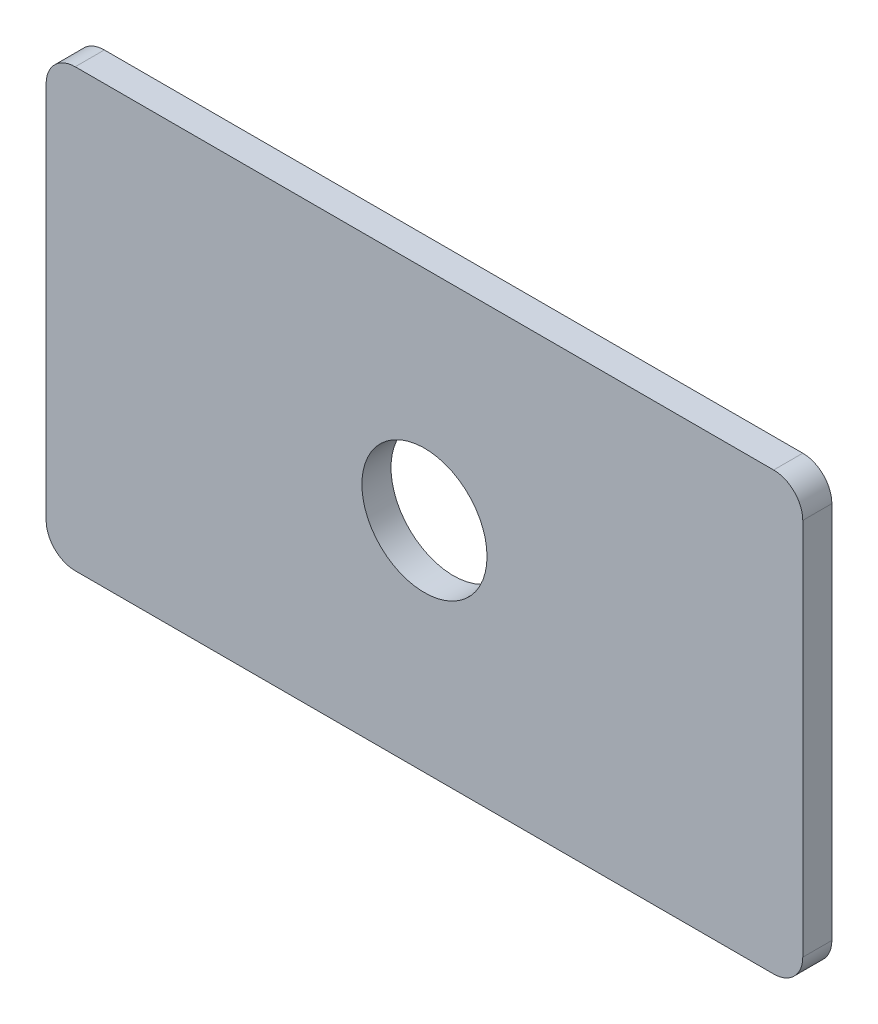
ISO-10303-21;
HEADER;
FILE_DESCRIPTION(('STEP AP214'),'2;1');
FILE_NAME('part.step','',(''),(''),'','','');
FILE_SCHEMA(('AUTOMOTIVE_DESIGN { 1 0 10303 214 1 1 1 1 }'));
ENDSEC;
DATA;
#1=APPLICATION_CONTEXT('core data for automotive mechanical design processes');
#2=APPLICATION_PROTOCOL_DEFINITION('international standard','automotive_design',2000,#1);
#3=PRODUCT_CONTEXT('',#1,'mechanical');
#4=PRODUCT('Part','Part','',(#3));
#5=PRODUCT_RELATED_PRODUCT_CATEGORY('part','',(#4));
#6=PRODUCT_DEFINITION_FORMATION('','',#4);
#7=PRODUCT_DEFINITION_CONTEXT('part definition',#1,'design');
#8=PRODUCT_DEFINITION('design','',#6,#7);
#9=PRODUCT_DEFINITION_SHAPE('','',#8);
#10=(LENGTH_UNIT() NAMED_UNIT(*) SI_UNIT(.MILLI.,.METRE.));
#11=(NAMED_UNIT(*) PLANE_ANGLE_UNIT() SI_UNIT($,.RADIAN.));
#12=(NAMED_UNIT(*) SI_UNIT($,.STERADIAN.) SOLID_ANGLE_UNIT());
#13=UNCERTAINTY_MEASURE_WITH_UNIT(LENGTH_MEASURE(1.E-05),#10,'distance_accuracy_value','');
#14=(GEOMETRIC_REPRESENTATION_CONTEXT(3) GLOBAL_UNCERTAINTY_ASSIGNED_CONTEXT((#13)) GLOBAL_UNIT_ASSIGNED_CONTEXT((#10,
#11,#12)) REPRESENTATION_CONTEXT('',''));
#15=CARTESIAN_POINT('',(0.,0.,0.));
#16=DIRECTION('',(0.,0.,1.));
#17=DIRECTION('',(1.,0.,0.));
#18=AXIS2_PLACEMENT_3D('',#15,#16,#17);
#19=CARTESIAN_POINT('',(0.,0.,5.));
#20=DIRECTION('',(0.,0.,-1.));
#21=DIRECTION('',(-1.,0.,0.));
#22=AXIS2_PLACEMENT_3D('',#19,#20,#21);
#23=PLANE('',#22);
#24=DIRECTION('',(0.,-1.,0.));
#25=VECTOR('',#24,1.);
#26=CARTESIAN_POINT('',(-130.,-75.,5.));
#27=LINE('',#26,#25);
#28=CARTESIAN_POINT('',(-130.,65.,5.));
#29=VERTEX_POINT('',#28);
#30=CARTESIAN_POINT('',(-130.,-65.,5.));
#31=VERTEX_POINT('',#30);
#32=EDGE_CURVE('E180',#29,#31,#27,.T.);
#33=ORIENTED_EDGE('',*,*,#32,.T.);
#34=CARTESIAN_POINT('',(-120.,-65.,5.));
#35=DIRECTION('',(0.,0.,-1.));
#36=DIRECTION('',(-1.,0.,0.));
#37=AXIS2_PLACEMENT_3D('',#34,#35,#36);
#38=CIRCLE('',#37,10.);
#39=CARTESIAN_POINT('',(-120.,-75.,5.));
#40=VERTEX_POINT('',#39);
#41=EDGE_CURVE('E157',#31,#40,#38,.F.);
#42=ORIENTED_EDGE('',*,*,#41,.T.);
#43=DIRECTION('',(1.,0.,0.));
#44=VECTOR('',#43,1.);
#45=CARTESIAN_POINT('',(-130.,-75.,5.));
#46=LINE('',#45,#44);
#47=CARTESIAN_POINT('',(120.,-75.,5.));
#48=VERTEX_POINT('',#47);
#49=EDGE_CURVE('E128',#40,#48,#46,.T.);
#50=ORIENTED_EDGE('',*,*,#49,.T.);
#51=CARTESIAN_POINT('',(120.,-65.,5.));
#52=DIRECTION('',(0.,0.,-1.));
#53=DIRECTION('',(-1.,0.,0.));
#54=AXIS2_PLACEMENT_3D('',#51,#52,#53);
#55=CIRCLE('',#54,10.);
#56=CARTESIAN_POINT('',(130.,-65.,5.));
#57=VERTEX_POINT('',#56);
#58=EDGE_CURVE('E153',#48,#57,#55,.F.);
#59=ORIENTED_EDGE('',*,*,#58,.T.);
#60=DIRECTION('',(0.,1.,0.));
#61=VECTOR('',#60,1.);
#62=CARTESIAN_POINT('',(130.,-75.,5.));
#63=LINE('',#62,#61);
#64=CARTESIAN_POINT('',(130.,65.,5.));
#65=VERTEX_POINT('',#64);
#66=EDGE_CURVE('E136',#57,#65,#63,.T.);
#67=ORIENTED_EDGE('',*,*,#66,.T.);
#68=CARTESIAN_POINT('',(120.,65.,5.));
#69=DIRECTION('',(0.,0.,-1.));
#70=DIRECTION('',(-1.,0.,0.));
#71=AXIS2_PLACEMENT_3D('',#68,#69,#70);
#72=CIRCLE('',#71,10.);
#73=CARTESIAN_POINT('',(120.,75.,5.));
#74=VERTEX_POINT('',#73);
#75=EDGE_CURVE('E63',#65,#74,#72,.F.);
#76=ORIENTED_EDGE('',*,*,#75,.T.);
#77=DIRECTION('',(-1.,0.,0.));
#78=VECTOR('',#77,1.);
#79=CARTESIAN_POINT('',(-130.,75.,5.));
#80=LINE('',#79,#78);
#81=CARTESIAN_POINT('',(-120.,75.,5.));
#82=VERTEX_POINT('',#81);
#83=EDGE_CURVE('E139',#74,#82,#80,.T.);
#84=ORIENTED_EDGE('',*,*,#83,.T.);
#85=CARTESIAN_POINT('',(-120.,65.,5.));
#86=DIRECTION('',(0.,0.,-1.));
#87=DIRECTION('',(-1.,0.,0.));
#88=AXIS2_PLACEMENT_3D('',#85,#86,#87);
#89=CIRCLE('',#88,10.);
#90=EDGE_CURVE('E155',#82,#29,#89,.F.);
#91=ORIENTED_EDGE('',*,*,#90,.T.);
#92=EDGE_LOOP('',(#33,#42,#50,#59,#67,#76,#84,#91));
#93=FACE_BOUND('',#92,.T.);
#94=CARTESIAN_POINT('',(0.,0.,5.));
#95=DIRECTION('',(0.,0.,1.));
#96=DIRECTION('',(1.,0.,0.));
#97=AXIS2_PLACEMENT_3D('',#94,#95,#96);
#98=CIRCLE('',#97,21.5);
#99=CARTESIAN_POINT('',(21.5,0.,5.));
#100=VERTEX_POINT('',#99);
#101=EDGE_CURVE('E176',#100,#100,#98,.T.);
#102=ORIENTED_EDGE('',*,*,#101,.F.);
#103=EDGE_LOOP('',(#102));
#104=FACE_BOUND('',#103,.T.);
#105=ADVANCED_FACE('F41',(#93,#104),#23,.F.);
#106=CARTESIAN_POINT('',(0.,0.,-5.));
#107=DIRECTION('',(0.,0.,-1.));
#108=DIRECTION('',(-1.,0.,0.));
#109=AXIS2_PLACEMENT_3D('',#106,#107,#108);
#110=PLANE('',#109);
#111=DIRECTION('',(1.,0.,0.));
#112=VECTOR('',#111,1.);
#113=CARTESIAN_POINT('',(-130.,-75.,-5.));
#114=LINE('',#113,#112);
#115=CARTESIAN_POINT('',(-120.,-75.,-5.));
#116=VERTEX_POINT('',#115);
#117=CARTESIAN_POINT('',(120.,-75.,-5.));
#118=VERTEX_POINT('',#117);
#119=EDGE_CURVE('E125',#116,#118,#114,.T.);
#120=ORIENTED_EDGE('',*,*,#119,.F.);
#121=CARTESIAN_POINT('',(-120.,-65.,-5.));
#122=DIRECTION('',(0.,0.,-1.));
#123=DIRECTION('',(-1.,0.,0.));
#124=AXIS2_PLACEMENT_3D('',#121,#122,#123);
#125=CIRCLE('',#124,10.);
#126=CARTESIAN_POINT('',(-130.,-65.,-5.));
#127=VERTEX_POINT('',#126);
#128=EDGE_CURVE('E108',#116,#127,#125,.T.);
#129=ORIENTED_EDGE('',*,*,#128,.T.);
#130=DIRECTION('',(0.,-1.,0.));
#131=VECTOR('',#130,1.);
#132=CARTESIAN_POINT('',(-130.,-75.,-5.));
#133=LINE('',#132,#131);
#134=CARTESIAN_POINT('',(-130.,65.,-5.));
#135=VERTEX_POINT('',#134);
#136=EDGE_CURVE('E137',#135,#127,#133,.T.);
#137=ORIENTED_EDGE('',*,*,#136,.F.);
#138=CARTESIAN_POINT('',(-120.,65.,-5.));
#139=DIRECTION('',(0.,0.,-1.));
#140=DIRECTION('',(-1.,0.,0.));
#141=AXIS2_PLACEMENT_3D('',#138,#139,#140);
#142=CIRCLE('',#141,10.);
#143=CARTESIAN_POINT('',(-120.,75.,-5.));
#144=VERTEX_POINT('',#143);
#145=EDGE_CURVE('E119',#135,#144,#142,.T.);
#146=ORIENTED_EDGE('',*,*,#145,.T.);
#147=DIRECTION('',(-1.,0.,0.));
#148=VECTOR('',#147,1.);
#149=CARTESIAN_POINT('',(-130.,75.,-5.));
#150=LINE('',#149,#148);
#151=CARTESIAN_POINT('',(120.,75.,-5.));
#152=VERTEX_POINT('',#151);
#153=EDGE_CURVE('E141',#152,#144,#150,.T.);
#154=ORIENTED_EDGE('',*,*,#153,.F.);
#155=CARTESIAN_POINT('',(120.,65.,-5.));
#156=DIRECTION('',(0.,0.,-1.));
#157=DIRECTION('',(-1.,0.,0.));
#158=AXIS2_PLACEMENT_3D('',#155,#156,#157);
#159=CIRCLE('',#158,10.);
#160=CARTESIAN_POINT('',(130.,65.,-5.));
#161=VERTEX_POINT('',#160);
#162=EDGE_CURVE('E129',#152,#161,#159,.T.);
#163=ORIENTED_EDGE('',*,*,#162,.T.);
#164=DIRECTION('',(0.,1.,0.));
#165=VECTOR('',#164,1.);
#166=CARTESIAN_POINT('',(130.,-75.,-5.));
#167=LINE('',#166,#165);
#168=CARTESIAN_POINT('',(130.,-65.,-5.));
#169=VERTEX_POINT('',#168);
#170=EDGE_CURVE('E168',#169,#161,#167,.T.);
#171=ORIENTED_EDGE('',*,*,#170,.F.);
#172=CARTESIAN_POINT('',(120.,-65.,-5.));
#173=DIRECTION('',(0.,0.,-1.));
#174=DIRECTION('',(-1.,0.,0.));
#175=AXIS2_PLACEMENT_3D('',#172,#173,#174);
#176=CIRCLE('',#175,10.);
#177=EDGE_CURVE('E135',#169,#118,#176,.T.);
#178=ORIENTED_EDGE('',*,*,#177,.T.);
#179=EDGE_LOOP('',(#120,#129,#137,#146,#154,#163,#171,#178));
#180=FACE_BOUND('',#179,.T.);
#181=CARTESIAN_POINT('',(0.,0.,-5.));
#182=DIRECTION('',(0.,0.,1.));
#183=DIRECTION('',(1.,0.,0.));
#184=AXIS2_PLACEMENT_3D('',#181,#182,#183);
#185=CIRCLE('',#184,21.5);
#186=CARTESIAN_POINT('',(21.5,0.,-5.));
#187=VERTEX_POINT('',#186);
#188=EDGE_CURVE('E183',#187,#187,#185,.T.);
#189=ORIENTED_EDGE('',*,*,#188,.T.);
#190=EDGE_LOOP('',(#189));
#191=FACE_BOUND('',#190,.T.);
#192=ADVANCED_FACE('F132',(#180,#191),#110,.T.);
#193=CARTESIAN_POINT('',(130.,-75.,5.));
#194=DIRECTION('',(-1.,0.,0.));
#195=DIRECTION('',(0.,0.,1.));
#196=AXIS2_PLACEMENT_3D('',#193,#194,#195);
#197=PLANE('',#196);
#198=ORIENTED_EDGE('',*,*,#66,.F.);
#199=DIRECTION('',(0.,0.,-1.));
#200=VECTOR('',#199,1.);
#201=CARTESIAN_POINT('',(130.,-65.,5.));
#202=LINE('',#201,#200);
#203=EDGE_CURVE('E11',#57,#169,#202,.T.);
#204=ORIENTED_EDGE('',*,*,#203,.T.);
#205=ORIENTED_EDGE('',*,*,#170,.T.);
#206=DIRECTION('',(0.,0.,-1.));
#207=VECTOR('',#206,1.);
#208=CARTESIAN_POINT('',(130.,65.,5.));
#209=LINE('',#208,#207);
#210=EDGE_CURVE('E49',#161,#65,#209,.F.);
#211=ORIENTED_EDGE('',*,*,#210,.T.);
#212=EDGE_LOOP('',(#198,#204,#205,#211));
#213=FACE_BOUND('',#212,.T.);
#214=ADVANCED_FACE('F166',(#213),#197,.F.);
#215=CARTESIAN_POINT('',(-130.,75.,5.));
#216=DIRECTION('',(0.,-1.,0.));
#217=DIRECTION('',(0.,0.,-1.));
#218=AXIS2_PLACEMENT_3D('',#215,#216,#217);
#219=PLANE('',#218);
#220=ORIENTED_EDGE('',*,*,#153,.T.);
#221=DIRECTION('',(0.,0.,-1.));
#222=VECTOR('',#221,1.);
#223=CARTESIAN_POINT('',(-120.,75.,5.));
#224=LINE('',#223,#222);
#225=EDGE_CURVE('E56',#144,#82,#224,.F.);
#226=ORIENTED_EDGE('',*,*,#225,.T.);
#227=ORIENTED_EDGE('',*,*,#83,.F.);
#228=DIRECTION('',(0.,0.,-1.));
#229=VECTOR('',#228,1.);
#230=CARTESIAN_POINT('',(120.,75.,5.));
#231=LINE('',#230,#229);
#232=EDGE_CURVE('E159',#74,#152,#231,.T.);
#233=ORIENTED_EDGE('',*,*,#232,.T.);
#234=EDGE_LOOP('',(#220,#226,#227,#233));
#235=FACE_BOUND('',#234,.T.);
#236=ADVANCED_FACE('F175',(#235),#219,.F.);
#237=CARTESIAN_POINT('',(-130.,-75.,5.));
#238=DIRECTION('',(1.,0.,0.));
#239=DIRECTION('',(0.,0.,-1.));
#240=AXIS2_PLACEMENT_3D('',#237,#238,#239);
#241=PLANE('',#240);
#242=ORIENTED_EDGE('',*,*,#136,.T.);
#243=DIRECTION('',(0.,0.,-1.));
#244=VECTOR('',#243,1.);
#245=CARTESIAN_POINT('',(-130.,-65.,5.));
#246=LINE('',#245,#244);
#247=EDGE_CURVE('E113',#127,#31,#246,.F.);
#248=ORIENTED_EDGE('',*,*,#247,.T.);
#249=ORIENTED_EDGE('',*,*,#32,.F.);
#250=DIRECTION('',(0.,0.,-1.));
#251=VECTOR('',#250,1.);
#252=CARTESIAN_POINT('',(-130.,65.,5.));
#253=LINE('',#252,#251);
#254=EDGE_CURVE('E118',#29,#135,#253,.T.);
#255=ORIENTED_EDGE('',*,*,#254,.T.);
#256=EDGE_LOOP('',(#242,#248,#249,#255));
#257=FACE_BOUND('',#256,.T.);
#258=ADVANCED_FACE('F202',(#257),#241,.F.);
#259=CARTESIAN_POINT('',(-130.,-75.,5.));
#260=DIRECTION('',(0.,1.,0.));
#261=DIRECTION('',(0.,0.,1.));
#262=AXIS2_PLACEMENT_3D('',#259,#260,#261);
#263=PLANE('',#262);
#264=ORIENTED_EDGE('',*,*,#49,.F.);
#265=DIRECTION('',(0.,0.,-1.));
#266=VECTOR('',#265,1.);
#267=CARTESIAN_POINT('',(-120.,-75.,5.));
#268=LINE('',#267,#266);
#269=EDGE_CURVE('E112',#40,#116,#268,.T.);
#270=ORIENTED_EDGE('',*,*,#269,.T.);
#271=ORIENTED_EDGE('',*,*,#119,.T.);
#272=DIRECTION('',(0.,0.,-1.));
#273=VECTOR('',#272,1.);
#274=CARTESIAN_POINT('',(120.,-75.,5.));
#275=LINE('',#274,#273);
#276=EDGE_CURVE('E130',#118,#48,#275,.F.);
#277=ORIENTED_EDGE('',*,*,#276,.T.);
#278=EDGE_LOOP('',(#264,#270,#271,#277));
#279=FACE_BOUND('',#278,.T.);
#280=ADVANCED_FACE('F124',(#279),#263,.F.);
#281=CARTESIAN_POINT('',(0.,0.,5.));
#282=DIRECTION('',(0.,0.,-1.));
#283=DIRECTION('',(-1.,0.,0.));
#284=AXIS2_PLACEMENT_3D('',#281,#282,#283);
#285=CYLINDRICAL_SURFACE('',#284,21.5);
#286=ORIENTED_EDGE('',*,*,#101,.T.);
#287=EDGE_LOOP('',(#286));
#288=FACE_BOUND('',#287,.T.);
#289=ORIENTED_EDGE('',*,*,#188,.F.);
#290=EDGE_LOOP('',(#289));
#291=FACE_BOUND('',#290,.T.);
#292=ADVANCED_FACE('F189',(#288,#291),#285,.F.);
#293=CARTESIAN_POINT('',(-120.,-65.,5.));
#294=DIRECTION('',(0.,0.,-1.));
#295=DIRECTION('',(-1.,0.,0.));
#296=AXIS2_PLACEMENT_3D('',#293,#294,#295);
#297=CYLINDRICAL_SURFACE('',#296,10.);
#298=ORIENTED_EDGE('',*,*,#41,.F.);
#299=ORIENTED_EDGE('',*,*,#247,.F.);
#300=ORIENTED_EDGE('',*,*,#128,.F.);
#301=ORIENTED_EDGE('',*,*,#269,.F.);
#302=EDGE_LOOP('',(#298,#299,#300,#301));
#303=FACE_BOUND('',#302,.T.);
#304=ADVANCED_FACE('F111',(#303),#297,.T.);
#305=CARTESIAN_POINT('',(-120.,65.,5.));
#306=DIRECTION('',(0.,0.,-1.));
#307=DIRECTION('',(-1.,0.,0.));
#308=AXIS2_PLACEMENT_3D('',#305,#306,#307);
#309=CYLINDRICAL_SURFACE('',#308,10.);
#310=ORIENTED_EDGE('',*,*,#90,.F.);
#311=ORIENTED_EDGE('',*,*,#225,.F.);
#312=ORIENTED_EDGE('',*,*,#145,.F.);
#313=ORIENTED_EDGE('',*,*,#254,.F.);
#314=EDGE_LOOP('',(#310,#311,#312,#313));
#315=FACE_BOUND('',#314,.T.);
#316=ADVANCED_FACE('F212',(#315),#309,.T.);
#317=CARTESIAN_POINT('',(120.,-65.,5.));
#318=DIRECTION('',(0.,0.,-1.));
#319=DIRECTION('',(-1.,0.,0.));
#320=AXIS2_PLACEMENT_3D('',#317,#318,#319);
#321=CYLINDRICAL_SURFACE('',#320,10.);
#322=ORIENTED_EDGE('',*,*,#58,.F.);
#323=ORIENTED_EDGE('',*,*,#276,.F.);
#324=ORIENTED_EDGE('',*,*,#177,.F.);
#325=ORIENTED_EDGE('',*,*,#203,.F.);
#326=EDGE_LOOP('',(#322,#323,#324,#325));
#327=FACE_BOUND('',#326,.T.);
#328=ADVANCED_FACE('F214',(#327),#321,.T.);
#329=CARTESIAN_POINT('',(120.,65.,5.));
#330=DIRECTION('',(0.,0.,-1.));
#331=DIRECTION('',(-1.,0.,0.));
#332=AXIS2_PLACEMENT_3D('',#329,#330,#331);
#333=CYLINDRICAL_SURFACE('',#332,10.);
#334=ORIENTED_EDGE('',*,*,#75,.F.);
#335=ORIENTED_EDGE('',*,*,#210,.F.);
#336=ORIENTED_EDGE('',*,*,#162,.F.);
#337=ORIENTED_EDGE('',*,*,#232,.F.);
#338=EDGE_LOOP('',(#334,#335,#336,#337));
#339=FACE_BOUND('',#338,.T.);
#340=ADVANCED_FACE('F43',(#339),#333,.T.);
#341=CLOSED_SHELL('',(#105,#192,#214,#236,#258,#280,#292,#304,#316,#328,#340));
#342=MANIFOLD_SOLID_BREP('B2',#341);
#343=ADVANCED_BREP_SHAPE_REPRESENTATION('',(#18,#342),#14);
#344=SHAPE_DEFINITION_REPRESENTATION(#9,#343);
ENDSEC;
END-ISO-10303-21;
